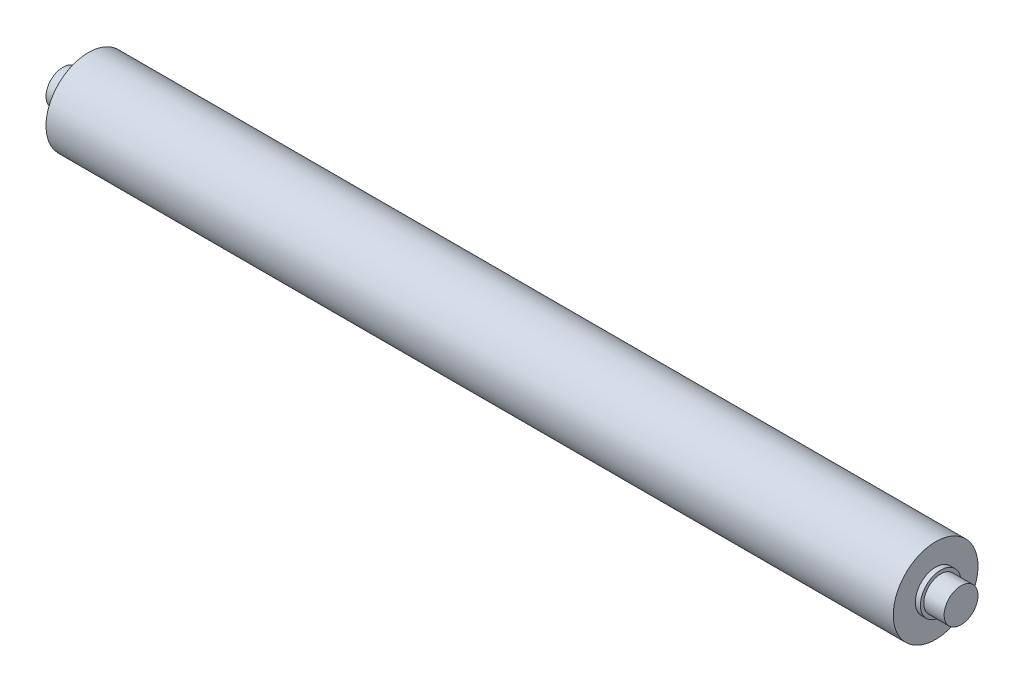
ISO-10303-21;
HEADER;
FILE_DESCRIPTION(('STEP AP214'),'2;1');
FILE_NAME('part.step','',(''),(''),'','','');
FILE_SCHEMA(('AUTOMOTIVE_DESIGN { 1 0 10303 214 1 1 1 1 }'));
ENDSEC;
DATA;
#1=APPLICATION_CONTEXT('core data for automotive mechanical design processes');
#2=APPLICATION_PROTOCOL_DEFINITION('international standard','automotive_design',2000,#1);
#3=PRODUCT_CONTEXT('',#1,'mechanical');
#4=PRODUCT('Part','Part','',(#3));
#5=PRODUCT_RELATED_PRODUCT_CATEGORY('part','',(#4));
#6=PRODUCT_DEFINITION_FORMATION('','',#4);
#7=PRODUCT_DEFINITION_CONTEXT('part definition',#1,'design');
#8=PRODUCT_DEFINITION('design','',#6,#7);
#9=PRODUCT_DEFINITION_SHAPE('','',#8);
#10=(LENGTH_UNIT() NAMED_UNIT(*) SI_UNIT(.MILLI.,.METRE.));
#11=(NAMED_UNIT(*) PLANE_ANGLE_UNIT() SI_UNIT($,.RADIAN.));
#12=(NAMED_UNIT(*) SI_UNIT($,.STERADIAN.) SOLID_ANGLE_UNIT());
#13=UNCERTAINTY_MEASURE_WITH_UNIT(LENGTH_MEASURE(1.E-05),#10,'distance_accuracy_value','');
#14=(GEOMETRIC_REPRESENTATION_CONTEXT(3) GLOBAL_UNCERTAINTY_ASSIGNED_CONTEXT((#13)) GLOBAL_UNIT_ASSIGNED_CONTEXT((#10,
#11,#12)) REPRESENTATION_CONTEXT('',''));
#15=CARTESIAN_POINT('',(0.,0.,0.));
#16=DIRECTION('',(0.,0.,1.));
#17=DIRECTION('',(1.,0.,0.));
#18=AXIS2_PLACEMENT_3D('',#15,#16,#17);
#19=CARTESIAN_POINT('',(-265.,0.,0.));
#20=DIRECTION('',(-1.,0.,0.));
#21=DIRECTION('',(0.,-1.,0.));
#22=AXIS2_PLACEMENT_3D('',#19,#20,#21);
#23=PLANE('',#22);
#24=CARTESIAN_POINT('',(-265.,0.,0.));
#25=DIRECTION('',(1.,0.,0.));
#26=DIRECTION('',(0.,1.,0.));
#27=AXIS2_PLACEMENT_3D('',#24,#25,#26);
#28=CIRCLE('',#27,10.);
#29=CARTESIAN_POINT('',(-265.,9.99999999999998,0.));
#30=VERTEX_POINT('',#29);
#31=EDGE_CURVE('E61',#30,#30,#28,.T.);
#32=ORIENTED_EDGE('',*,*,#31,.F.);
#33=EDGE_LOOP('',(#32));
#34=FACE_BOUND('',#33,.T.);
#35=ADVANCED_FACE('F40',(#34),#23,.T.);
#36=CARTESIAN_POINT('',(265.,0.,0.));
#37=DIRECTION('',(1.,0.,0.));
#38=DIRECTION('',(0.,1.,0.));
#39=AXIS2_PLACEMENT_3D('',#36,#37,#38);
#40=CYLINDRICAL_SURFACE('',#39,10.);
#41=ORIENTED_EDGE('',*,*,#31,.T.);
#42=EDGE_LOOP('',(#41));
#43=FACE_BOUND('',#42,.T.);
#44=CARTESIAN_POINT('',(-253.,0.,0.));
#45=DIRECTION('',(1.,0.,0.));
#46=DIRECTION('',(0.,1.,0.));
#47=AXIS2_PLACEMENT_3D('',#44,#45,#46);
#48=CIRCLE('',#47,10.);
#49=CARTESIAN_POINT('',(-253.,9.99999999999998,0.));
#50=VERTEX_POINT('',#49);
#51=EDGE_CURVE('E64',#50,#50,#48,.T.);
#52=ORIENTED_EDGE('',*,*,#51,.F.);
#53=EDGE_LOOP('',(#52));
#54=FACE_BOUND('',#53,.T.);
#55=ADVANCED_FACE('F108',(#43,#54),#40,.T.);
#56=CARTESIAN_POINT('',(-253.,9.99999999999998,0.));
#57=DIRECTION('',(-1.,0.,0.));
#58=DIRECTION('',(0.,-1.,0.));
#59=AXIS2_PLACEMENT_3D('',#56,#57,#58);
#60=PLANE('',#59);
#61=ORIENTED_EDGE('',*,*,#51,.T.);
#62=EDGE_LOOP('',(#61));
#63=FACE_BOUND('',#62,.T.);
#64=CARTESIAN_POINT('',(-253.,0.,0.));
#65=DIRECTION('',(1.,0.,0.));
#66=DIRECTION('',(0.,1.,0.));
#67=AXIS2_PLACEMENT_3D('',#64,#65,#66);
#68=CIRCLE('',#67,12.);
#69=CARTESIAN_POINT('',(-253.,12.,0.));
#70=VERTEX_POINT('',#69);
#71=EDGE_CURVE('E67',#70,#70,#68,.T.);
#72=ORIENTED_EDGE('',*,*,#71,.F.);
#73=EDGE_LOOP('',(#72));
#74=FACE_BOUND('',#73,.T.);
#75=ADVANCED_FACE('F114',(#63,#74),#60,.T.);
#76=CARTESIAN_POINT('',(265.,0.,0.));
#77=DIRECTION('',(1.,0.,0.));
#78=DIRECTION('',(0.,1.,0.));
#79=AXIS2_PLACEMENT_3D('',#76,#77,#78);
#80=CYLINDRICAL_SURFACE('',#79,12.);
#81=ORIENTED_EDGE('',*,*,#71,.T.);
#82=EDGE_LOOP('',(#81));
#83=FACE_BOUND('',#82,.T.);
#84=CARTESIAN_POINT('',(-250.,0.,0.));
#85=DIRECTION('',(1.,0.,0.));
#86=DIRECTION('',(0.,1.,0.));
#87=AXIS2_PLACEMENT_3D('',#84,#85,#86);
#88=CIRCLE('',#87,12.);
#89=CARTESIAN_POINT('',(-250.,12.,0.));
#90=VERTEX_POINT('',#89);
#91=EDGE_CURVE('E70',#90,#90,#88,.T.);
#92=ORIENTED_EDGE('',*,*,#91,.F.);
#93=EDGE_LOOP('',(#92));
#94=FACE_BOUND('',#93,.T.);
#95=ADVANCED_FACE('F196',(#83,#94),#80,.T.);
#96=CARTESIAN_POINT('',(-250.,12.,0.));
#97=DIRECTION('',(-1.,0.,0.));
#98=DIRECTION('',(0.,-1.,0.));
#99=AXIS2_PLACEMENT_3D('',#96,#97,#98);
#100=PLANE('',#99);
#101=ORIENTED_EDGE('',*,*,#91,.T.);
#102=EDGE_LOOP('',(#101));
#103=FACE_BOUND('',#102,.T.);
#104=CARTESIAN_POINT('',(-250.,0.,0.));
#105=DIRECTION('',(1.,0.,0.));
#106=DIRECTION('',(0.,1.,0.));
#107=AXIS2_PLACEMENT_3D('',#104,#105,#106);
#108=CIRCLE('',#107,25.);
#109=CARTESIAN_POINT('',(-250.,25.,0.));
#110=VERTEX_POINT('',#109);
#111=EDGE_CURVE('E73',#110,#110,#108,.T.);
#112=ORIENTED_EDGE('',*,*,#111,.F.);
#113=EDGE_LOOP('',(#112));
#114=FACE_BOUND('',#113,.T.);
#115=ADVANCED_FACE('F186',(#103,#114),#100,.T.);
#116=CARTESIAN_POINT('',(265.,0.,0.));
#117=DIRECTION('',(1.,0.,0.));
#118=DIRECTION('',(0.,1.,0.));
#119=AXIS2_PLACEMENT_3D('',#116,#117,#118);
#120=CYLINDRICAL_SURFACE('',#119,25.);
#121=ORIENTED_EDGE('',*,*,#111,.T.);
#122=EDGE_LOOP('',(#121));
#123=FACE_BOUND('',#122,.T.);
#124=CARTESIAN_POINT('',(250.,0.,0.));
#125=DIRECTION('',(1.,0.,0.));
#126=DIRECTION('',(0.,1.,0.));
#127=AXIS2_PLACEMENT_3D('',#124,#125,#126);
#128=CIRCLE('',#127,25.);
#129=CARTESIAN_POINT('',(250.,25.,0.));
#130=VERTEX_POINT('',#129);
#131=EDGE_CURVE('E76',#130,#130,#128,.T.);
#132=ORIENTED_EDGE('',*,*,#131,.F.);
#133=EDGE_LOOP('',(#132));
#134=FACE_BOUND('',#133,.T.);
#135=ADVANCED_FACE('F176',(#123,#134),#120,.T.);
#136=CARTESIAN_POINT('',(250.,12.,0.));
#137=DIRECTION('',(1.,0.,0.));
#138=DIRECTION('',(0.,1.,0.));
#139=AXIS2_PLACEMENT_3D('',#136,#137,#138);
#140=PLANE('',#139);
#141=ORIENTED_EDGE('',*,*,#131,.T.);
#142=EDGE_LOOP('',(#141));
#143=FACE_BOUND('',#142,.T.);
#144=CARTESIAN_POINT('',(250.,0.,0.));
#145=DIRECTION('',(1.,0.,0.));
#146=DIRECTION('',(0.,1.,0.));
#147=AXIS2_PLACEMENT_3D('',#144,#145,#146);
#148=CIRCLE('',#147,12.);
#149=CARTESIAN_POINT('',(250.,12.,0.));
#150=VERTEX_POINT('',#149);
#151=EDGE_CURVE('E79',#150,#150,#148,.T.);
#152=ORIENTED_EDGE('',*,*,#151,.F.);
#153=EDGE_LOOP('',(#152));
#154=FACE_BOUND('',#153,.T.);
#155=ADVANCED_FACE('F166',(#143,#154),#140,.T.);
#156=CARTESIAN_POINT('',(265.,0.,0.));
#157=DIRECTION('',(1.,0.,0.));
#158=DIRECTION('',(0.,1.,0.));
#159=AXIS2_PLACEMENT_3D('',#156,#157,#158);
#160=CYLINDRICAL_SURFACE('',#159,12.);
#161=ORIENTED_EDGE('',*,*,#151,.T.);
#162=EDGE_LOOP('',(#161));
#163=FACE_BOUND('',#162,.T.);
#164=CARTESIAN_POINT('',(253.,0.,0.));
#165=DIRECTION('',(1.,0.,0.));
#166=DIRECTION('',(0.,1.,0.));
#167=AXIS2_PLACEMENT_3D('',#164,#165,#166);
#168=CIRCLE('',#167,12.);
#169=CARTESIAN_POINT('',(253.,12.,0.));
#170=VERTEX_POINT('',#169);
#171=EDGE_CURVE('E82',#170,#170,#168,.T.);
#172=ORIENTED_EDGE('',*,*,#171,.F.);
#173=EDGE_LOOP('',(#172));
#174=FACE_BOUND('',#173,.T.);
#175=ADVANCED_FACE('F104',(#163,#174),#160,.T.);
#176=CARTESIAN_POINT('',(253.,9.99999999999998,0.));
#177=DIRECTION('',(1.,0.,0.));
#178=DIRECTION('',(0.,1.,0.));
#179=AXIS2_PLACEMENT_3D('',#176,#177,#178);
#180=PLANE('',#179);
#181=ORIENTED_EDGE('',*,*,#171,.T.);
#182=EDGE_LOOP('',(#181));
#183=FACE_BOUND('',#182,.T.);
#184=CARTESIAN_POINT('',(253.,0.,0.));
#185=DIRECTION('',(1.,0.,0.));
#186=DIRECTION('',(0.,1.,0.));
#187=AXIS2_PLACEMENT_3D('',#184,#185,#186);
#188=CIRCLE('',#187,9.99999999999998);
#189=CARTESIAN_POINT('',(253.,9.99999999999998,0.));
#190=VERTEX_POINT('',#189);
#191=EDGE_CURVE('E85',#190,#190,#188,.T.);
#192=ORIENTED_EDGE('',*,*,#191,.F.);
#193=EDGE_LOOP('',(#192));
#194=FACE_BOUND('',#193,.T.);
#195=ADVANCED_FACE('F96',(#183,#194),#180,.T.);
#196=CARTESIAN_POINT('',(265.,0.,0.));
#197=DIRECTION('',(1.,0.,0.));
#198=DIRECTION('',(0.,1.,0.));
#199=AXIS2_PLACEMENT_3D('',#196,#197,#198);
#200=CYLINDRICAL_SURFACE('',#199,9.99999999999998);
#201=ORIENTED_EDGE('',*,*,#191,.T.);
#202=EDGE_LOOP('',(#201));
#203=FACE_BOUND('',#202,.T.);
#204=CARTESIAN_POINT('',(265.,0.,0.));
#205=DIRECTION('',(1.,0.,0.));
#206=DIRECTION('',(0.,1.,0.));
#207=AXIS2_PLACEMENT_3D('',#204,#205,#206);
#208=CIRCLE('',#207,9.99999999999998);
#209=CARTESIAN_POINT('',(265.,9.99999999999998,0.));
#210=VERTEX_POINT('',#209);
#211=EDGE_CURVE('E88',#210,#210,#208,.T.);
#212=ORIENTED_EDGE('',*,*,#211,.F.);
#213=EDGE_LOOP('',(#212));
#214=FACE_BOUND('',#213,.T.);
#215=ADVANCED_FACE('F94',(#203,#214),#200,.T.);
#216=CARTESIAN_POINT('',(265.,0.,0.));
#217=DIRECTION('',(1.,0.,0.));
#218=DIRECTION('',(0.,1.,0.));
#219=AXIS2_PLACEMENT_3D('',#216,#217,#218);
#220=PLANE('',#219);
#221=ORIENTED_EDGE('',*,*,#211,.T.);
#222=EDGE_LOOP('',(#221));
#223=FACE_BOUND('',#222,.T.);
#224=ADVANCED_FACE('F92',(#223),#220,.T.);
#225=CLOSED_SHELL('',(#35,#55,#75,#95,#115,#135,#155,#175,#195,#215,#224));
#226=CARTESIAN_POINT('',(265.,0.,0.));
#227=DIRECTION('',(1.,0.,0.));
#228=DIRECTION('',(0.,1.,0.));
#229=AXIS2_PLACEMENT_3D('',#226,#227,#228);
#230=CYLINDRICAL_SURFACE('',#229,12.);
#231=CARTESIAN_POINT('',(247.,0.,0.));
#232=DIRECTION('',(1.,0.,0.));
#233=DIRECTION('',(0.,1.,0.));
#234=AXIS2_PLACEMENT_3D('',#231,#232,#233);
#235=CIRCLE('',#234,12.);
#236=CARTESIAN_POINT('',(247.,12.,0.));
#237=VERTEX_POINT('',#236);
#238=EDGE_CURVE('E10',#237,#237,#235,.T.);
#239=ORIENTED_EDGE('',*,*,#238,.F.);
#240=EDGE_LOOP('',(#239));
#241=FACE_BOUND('',#240,.T.);
#242=CARTESIAN_POINT('',(-247.,0.,0.));
#243=DIRECTION('',(1.,0.,0.));
#244=DIRECTION('',(0.,1.,0.));
#245=AXIS2_PLACEMENT_3D('',#242,#243,#244);
#246=CIRCLE('',#245,12.);
#247=CARTESIAN_POINT('',(-247.,12.,0.));
#248=VERTEX_POINT('',#247);
#249=EDGE_CURVE('E56',#248,#248,#246,.T.);
#250=ORIENTED_EDGE('',*,*,#249,.T.);
#251=EDGE_LOOP('',(#250));
#252=FACE_BOUND('',#251,.T.);
#253=ADVANCED_FACE('F42',(#241,#252),#230,.T.);
#254=CARTESIAN_POINT('',(247.,21.9999999999999,0.));
#255=DIRECTION('',(1.,0.,0.));
#256=DIRECTION('',(0.,1.,0.));
#257=AXIS2_PLACEMENT_3D('',#254,#255,#256);
#258=PLANE('',#257);
#259=CARTESIAN_POINT('',(247.,0.,0.));
#260=DIRECTION('',(1.,0.,0.));
#261=DIRECTION('',(0.,1.,0.));
#262=AXIS2_PLACEMENT_3D('',#259,#260,#261);
#263=CIRCLE('',#262,21.9999999999999);
#264=CARTESIAN_POINT('',(247.,21.9999999999999,0.));
#265=VERTEX_POINT('',#264);
#266=EDGE_CURVE('E48',#265,#265,#263,.T.);
#267=ORIENTED_EDGE('',*,*,#266,.F.);
#268=EDGE_LOOP('',(#267));
#269=FACE_BOUND('',#268,.T.);
#270=ORIENTED_EDGE('',*,*,#238,.T.);
#271=EDGE_LOOP('',(#270));
#272=FACE_BOUND('',#271,.T.);
#273=ADVANCED_FACE('F127',(#269,#272),#258,.F.);
#274=CARTESIAN_POINT('',(265.,0.,0.));
#275=DIRECTION('',(1.,0.,0.));
#276=DIRECTION('',(0.,1.,0.));
#277=AXIS2_PLACEMENT_3D('',#274,#275,#276);
#278=CYLINDRICAL_SURFACE('',#277,21.9999999999999);
#279=CARTESIAN_POINT('',(-247.,0.,0.));
#280=DIRECTION('',(1.,0.,0.));
#281=DIRECTION('',(0.,1.,0.));
#282=AXIS2_PLACEMENT_3D('',#279,#280,#281);
#283=CIRCLE('',#282,21.9999999999999);
#284=CARTESIAN_POINT('',(-247.,21.9999999999999,0.));
#285=VERTEX_POINT('',#284);
#286=EDGE_CURVE('E52',#285,#285,#283,.T.);
#287=ORIENTED_EDGE('',*,*,#286,.F.);
#288=EDGE_LOOP('',(#287));
#289=FACE_BOUND('',#288,.T.);
#290=ORIENTED_EDGE('',*,*,#266,.T.);
#291=EDGE_LOOP('',(#290));
#292=FACE_BOUND('',#291,.T.);
#293=ADVANCED_FACE('F123',(#289,#292),#278,.F.);
#294=CARTESIAN_POINT('',(-247.,21.9999999999999,0.));
#295=DIRECTION('',(-1.,0.,0.));
#296=DIRECTION('',(0.,-1.,0.));
#297=AXIS2_PLACEMENT_3D('',#294,#295,#296);
#298=PLANE('',#297);
#299=ORIENTED_EDGE('',*,*,#249,.F.);
#300=EDGE_LOOP('',(#299));
#301=FACE_BOUND('',#300,.T.);
#302=ORIENTED_EDGE('',*,*,#286,.T.);
#303=EDGE_LOOP('',(#302));
#304=FACE_BOUND('',#303,.T.);
#305=ADVANCED_FACE('F120',(#301,#304),#298,.F.);
#306=CLOSED_SHELL('',(#253,#273,#293,#305));
#307=ORIENTED_CLOSED_SHELL('',*,#306,.T.);
#308=BREP_WITH_VOIDS('B2',#225,(#307));
#309=ADVANCED_BREP_SHAPE_REPRESENTATION('',(#18,#308),#14);
#310=SHAPE_DEFINITION_REPRESENTATION(#9,#309);
ENDSEC;
END-ISO-10303-21;
